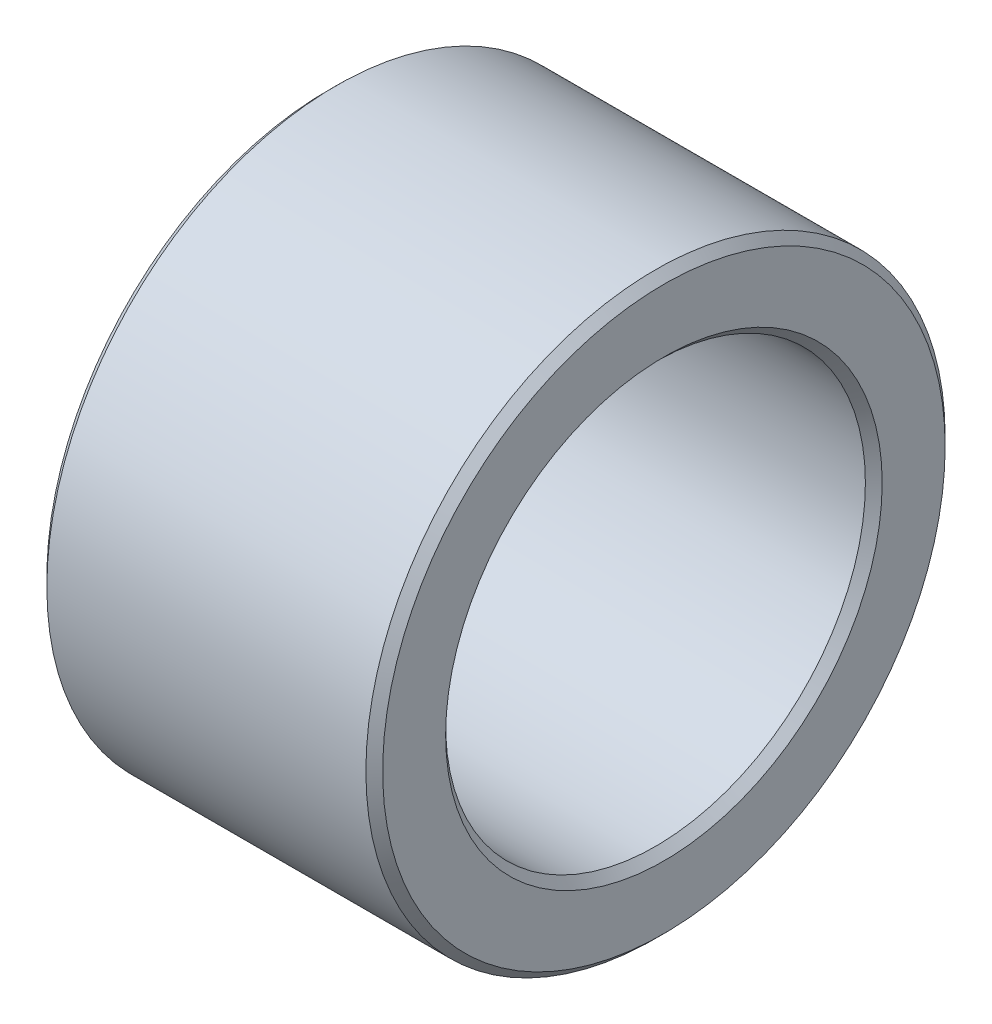
ISO-10303-21;
HEADER;
FILE_DESCRIPTION(('STEP AP214'),'2;1');
FILE_NAME('part.step','',(''),(''),'','','');
FILE_SCHEMA(('AUTOMOTIVE_DESIGN { 1 0 10303 214 1 1 1 1 }'));
ENDSEC;
DATA;
#1=APPLICATION_CONTEXT('core data for automotive mechanical design processes');
#2=APPLICATION_PROTOCOL_DEFINITION('international standard','automotive_design',2000,#1);
#3=PRODUCT_CONTEXT('',#1,'mechanical');
#4=PRODUCT('Part','Part','',(#3));
#5=PRODUCT_RELATED_PRODUCT_CATEGORY('part','',(#4));
#6=PRODUCT_DEFINITION_FORMATION('','',#4);
#7=PRODUCT_DEFINITION_CONTEXT('part definition',#1,'design');
#8=PRODUCT_DEFINITION('design','',#6,#7);
#9=PRODUCT_DEFINITION_SHAPE('','',#8);
#10=(LENGTH_UNIT() NAMED_UNIT(*) SI_UNIT(.MILLI.,.METRE.));
#11=(NAMED_UNIT(*) PLANE_ANGLE_UNIT() SI_UNIT($,.RADIAN.));
#12=(NAMED_UNIT(*) SI_UNIT($,.STERADIAN.) SOLID_ANGLE_UNIT());
#13=UNCERTAINTY_MEASURE_WITH_UNIT(LENGTH_MEASURE(1.E-05),#10,'distance_accuracy_value','');
#14=(GEOMETRIC_REPRESENTATION_CONTEXT(3) GLOBAL_UNCERTAINTY_ASSIGNED_CONTEXT((#13)) GLOBAL_UNIT_ASSIGNED_CONTEXT((#10,
#11,#12)) REPRESENTATION_CONTEXT('',''));
#15=CARTESIAN_POINT('',(0.,0.,0.));
#16=DIRECTION('',(0.,0.,1.));
#17=DIRECTION('',(1.,0.,0.));
#18=AXIS2_PLACEMENT_3D('',#15,#16,#17);
#19=CARTESIAN_POINT('',(4.,0.,0.));
#20=DIRECTION('',(1.,0.,0.));
#21=DIRECTION('',(0.,0.,-1.));
#22=AXIS2_PLACEMENT_3D('',#19,#20,#21);
#23=PLANE('',#22);
#24=CARTESIAN_POINT('',(4.,0.,0.));
#25=DIRECTION('',(1.,0.,0.));
#26=DIRECTION('',(0.,0.,-1.));
#27=AXIS2_PLACEMENT_3D('',#24,#25,#26);
#28=CIRCLE('',#27,2.6);
#29=CARTESIAN_POINT('',(4.,0.,-2.6));
#30=VERTEX_POINT('',#29);
#31=EDGE_CURVE('E64',#30,#30,#28,.F.);
#32=ORIENTED_EDGE('',*,*,#31,.T.);
#33=EDGE_LOOP('',(#32));
#34=FACE_BOUND('',#33,.T.);
#35=CARTESIAN_POINT('',(4.,0.,0.));
#36=DIRECTION('',(1.,0.,0.));
#37=DIRECTION('',(0.,0.,-1.));
#38=AXIS2_PLACEMENT_3D('',#35,#36,#37);
#39=CIRCLE('',#38,3.35);
#40=CARTESIAN_POINT('',(4.,0.,-3.35));
#41=VERTEX_POINT('',#40);
#42=EDGE_CURVE('E67',#41,#41,#39,.T.);
#43=ORIENTED_EDGE('',*,*,#42,.T.);
#44=EDGE_LOOP('',(#43));
#45=FACE_BOUND('',#44,.T.);
#46=ADVANCED_FACE('F43',(#34,#45),#23,.T.);
#47=CARTESIAN_POINT('',(0.,0.,0.));
#48=DIRECTION('',(1.,0.,0.));
#49=DIRECTION('',(0.,0.,-1.));
#50=AXIS2_PLACEMENT_3D('',#47,#48,#49);
#51=PLANE('',#50);
#52=CARTESIAN_POINT('',(0.,0.,0.));
#53=DIRECTION('',(1.,0.,0.));
#54=DIRECTION('',(0.,0.,-1.));
#55=AXIS2_PLACEMENT_3D('',#52,#53,#54);
#56=CIRCLE('',#55,2.6);
#57=CARTESIAN_POINT('',(0.,0.,-2.6));
#58=VERTEX_POINT('',#57);
#59=EDGE_CURVE('E55',#58,#58,#56,.T.);
#60=ORIENTED_EDGE('',*,*,#59,.T.);
#61=EDGE_LOOP('',(#60));
#62=FACE_BOUND('',#61,.T.);
#63=CARTESIAN_POINT('',(0.,0.,0.));
#64=DIRECTION('',(1.,0.,0.));
#65=DIRECTION('',(0.,0.,-1.));
#66=AXIS2_PLACEMENT_3D('',#63,#64,#65);
#67=CIRCLE('',#66,3.35);
#68=CARTESIAN_POINT('',(0.,0.,-3.35));
#69=VERTEX_POINT('',#68);
#70=EDGE_CURVE('E59',#69,#69,#67,.F.);
#71=ORIENTED_EDGE('',*,*,#70,.T.);
#72=EDGE_LOOP('',(#71));
#73=FACE_BOUND('',#72,.T.);
#74=ADVANCED_FACE('F87',(#62,#73),#51,.F.);
#75=CARTESIAN_POINT('',(4.,0.,0.));
#76=DIRECTION('',(-1.,0.,0.));
#77=DIRECTION('',(0.,0.,1.));
#78=AXIS2_PLACEMENT_3D('',#75,#76,#77);
#79=CYLINDRICAL_SURFACE('',#78,3.45);
#80=CARTESIAN_POINT('',(0.0999999999999985,0.,0.));
#81=DIRECTION('',(1.,0.,0.));
#82=DIRECTION('',(0.,0.,-1.));
#83=AXIS2_PLACEMENT_3D('',#80,#81,#82);
#84=CIRCLE('',#83,3.45);
#85=CARTESIAN_POINT('',(0.0999999999999985,0.,-3.45));
#86=VERTEX_POINT('',#85);
#87=EDGE_CURVE('E10',#86,#86,#84,.T.);
#88=ORIENTED_EDGE('',*,*,#87,.T.);
#89=EDGE_LOOP('',(#88));
#90=FACE_BOUND('',#89,.T.);
#91=CARTESIAN_POINT('',(3.9,0.,0.));
#92=DIRECTION('',(1.,0.,0.));
#93=DIRECTION('',(0.,0.,-1.));
#94=AXIS2_PLACEMENT_3D('',#91,#92,#93);
#95=CIRCLE('',#94,3.45);
#96=CARTESIAN_POINT('',(3.9,0.,-3.45));
#97=VERTEX_POINT('',#96);
#98=EDGE_CURVE('E51',#97,#97,#95,.F.);
#99=ORIENTED_EDGE('',*,*,#98,.T.);
#100=EDGE_LOOP('',(#99));
#101=FACE_BOUND('',#100,.T.);
#102=ADVANCED_FACE('F90',(#90,#101),#79,.T.);
#103=CARTESIAN_POINT('',(4.,0.,0.));
#104=DIRECTION('',(-1.,0.,0.));
#105=DIRECTION('',(0.,0.,1.));
#106=AXIS2_PLACEMENT_3D('',#103,#104,#105);
#107=CYLINDRICAL_SURFACE('',#106,2.5);
#108=CARTESIAN_POINT('',(3.9,0.,0.));
#109=DIRECTION('',(1.,0.,0.));
#110=DIRECTION('',(0.,0.,-1.));
#111=AXIS2_PLACEMENT_3D('',#108,#109,#110);
#112=CIRCLE('',#111,2.5);
#113=CARTESIAN_POINT('',(3.9,0.,-2.5));
#114=VERTEX_POINT('',#113);
#115=EDGE_CURVE('E70',#114,#114,#112,.T.);
#116=ORIENTED_EDGE('',*,*,#115,.T.);
#117=EDGE_LOOP('',(#116));
#118=FACE_BOUND('',#117,.T.);
#119=CARTESIAN_POINT('',(0.100000000000001,0.,0.));
#120=DIRECTION('',(1.,0.,0.));
#121=DIRECTION('',(0.,0.,-1.));
#122=AXIS2_PLACEMENT_3D('',#119,#120,#121);
#123=CIRCLE('',#122,2.5);
#124=CARTESIAN_POINT('',(0.100000000000001,0.,-2.5));
#125=VERTEX_POINT('',#124);
#126=EDGE_CURVE('E73',#125,#125,#123,.F.);
#127=ORIENTED_EDGE('',*,*,#126,.T.);
#128=EDGE_LOOP('',(#127));
#129=FACE_BOUND('',#128,.T.);
#130=ADVANCED_FACE('F77',(#118,#129),#107,.F.);
#131=CARTESIAN_POINT('',(3.9,0.,0.));
#132=DIRECTION('',(1.,0.,0.));
#133=DIRECTION('',(0.,0.,-1.));
#134=AXIS2_PLACEMENT_3D('',#131,#132,#133);
#135=CONICAL_SURFACE('',#134,2.5,0.785398163397448);
#136=ORIENTED_EDGE('',*,*,#31,.F.);
#137=EDGE_LOOP('',(#136));
#138=FACE_BOUND('',#137,.T.);
#139=ORIENTED_EDGE('',*,*,#115,.F.);
#140=EDGE_LOOP('',(#139));
#141=FACE_BOUND('',#140,.T.);
#142=ADVANCED_FACE('F83',(#138,#141),#135,.F.);
#143=CARTESIAN_POINT('',(0.,0.,0.));
#144=DIRECTION('',(-1.,0.,0.));
#145=DIRECTION('',(0.,0.,1.));
#146=AXIS2_PLACEMENT_3D('',#143,#144,#145);
#147=CONICAL_SURFACE('',#146,2.6,0.785398163397446);
#148=ORIENTED_EDGE('',*,*,#126,.F.);
#149=EDGE_LOOP('',(#148));
#150=FACE_BOUND('',#149,.T.);
#151=ORIENTED_EDGE('',*,*,#59,.F.);
#152=EDGE_LOOP('',(#151));
#153=FACE_BOUND('',#152,.T.);
#154=ADVANCED_FACE('F79',(#150,#153),#147,.F.);
#155=CARTESIAN_POINT('',(0.0999999999999985,0.,0.));
#156=DIRECTION('',(1.,0.,0.));
#157=DIRECTION('',(0.,0.,-1.));
#158=AXIS2_PLACEMENT_3D('',#155,#156,#157);
#159=CONICAL_SURFACE('',#158,3.45,0.785398163397455);
#160=ORIENTED_EDGE('',*,*,#70,.F.);
#161=EDGE_LOOP('',(#160));
#162=FACE_BOUND('',#161,.T.);
#163=ORIENTED_EDGE('',*,*,#87,.F.);
#164=EDGE_LOOP('',(#163));
#165=FACE_BOUND('',#164,.T.);
#166=ADVANCED_FACE('F82',(#162,#165),#159,.T.);
#167=CARTESIAN_POINT('',(4.,0.,0.));
#168=DIRECTION('',(-1.,0.,0.));
#169=DIRECTION('',(0.,0.,1.));
#170=AXIS2_PLACEMENT_3D('',#167,#168,#169);
#171=CONICAL_SURFACE('',#170,3.35,0.785398163397448);
#172=ORIENTED_EDGE('',*,*,#98,.F.);
#173=EDGE_LOOP('',(#172));
#174=FACE_BOUND('',#173,.T.);
#175=ORIENTED_EDGE('',*,*,#42,.F.);
#176=EDGE_LOOP('',(#175));
#177=FACE_BOUND('',#176,.T.);
#178=ADVANCED_FACE('F46',(#174,#177),#171,.T.);
#179=CLOSED_SHELL('',(#46,#74,#102,#130,#142,#154,#166,#178));
#180=MANIFOLD_SOLID_BREP('B2',#179);
#181=ADVANCED_BREP_SHAPE_REPRESENTATION('',(#18,#180),#14);
#182=SHAPE_DEFINITION_REPRESENTATION(#9,#181);
ENDSEC;
END-ISO-10303-21;
